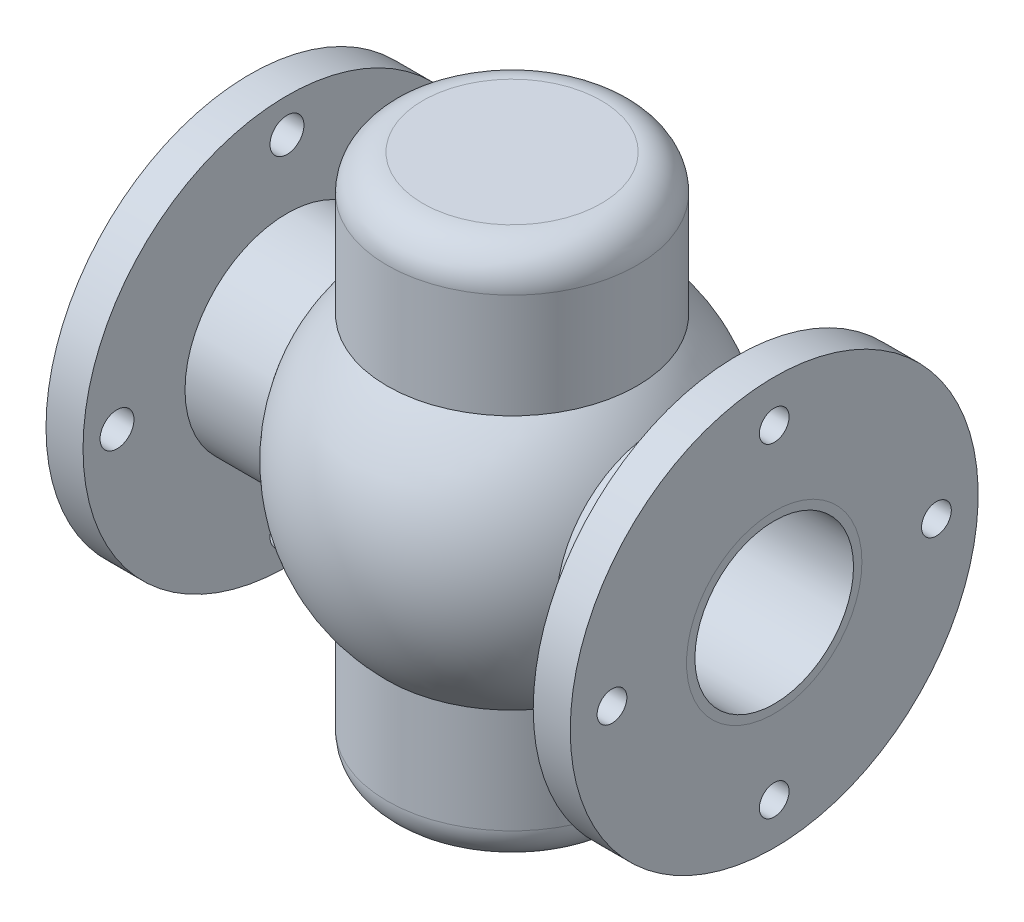
ISO-10303-21;
HEADER;
FILE_DESCRIPTION(('STEP AP214'),'2;1');
FILE_NAME('part.step','',(''),(''),'','','');
FILE_SCHEMA(('AUTOMOTIVE_DESIGN { 1 0 10303 214 1 1 1 1 }'));
ENDSEC;
DATA;
#1=APPLICATION_CONTEXT('core data for automotive mechanical design processes');
#2=APPLICATION_PROTOCOL_DEFINITION('international standard','automotive_design',2000,#1);
#3=PRODUCT_CONTEXT('',#1,'mechanical');
#4=PRODUCT('Part','Part','',(#3));
#5=PRODUCT_RELATED_PRODUCT_CATEGORY('part','',(#4));
#6=PRODUCT_DEFINITION_FORMATION('','',#4);
#7=PRODUCT_DEFINITION_CONTEXT('part definition',#1,'design');
#8=PRODUCT_DEFINITION('design','',#6,#7);
#9=PRODUCT_DEFINITION_SHAPE('','',#8);
#10=(LENGTH_UNIT() NAMED_UNIT(*) SI_UNIT(.MILLI.,.METRE.));
#11=(NAMED_UNIT(*) PLANE_ANGLE_UNIT() SI_UNIT($,.RADIAN.));
#12=(NAMED_UNIT(*) SI_UNIT($,.STERADIAN.) SOLID_ANGLE_UNIT());
#13=UNCERTAINTY_MEASURE_WITH_UNIT(LENGTH_MEASURE(1.E-05),#10,'distance_accuracy_value','');
#14=(GEOMETRIC_REPRESENTATION_CONTEXT(3) GLOBAL_UNCERTAINTY_ASSIGNED_CONTEXT((#13)) GLOBAL_UNIT_ASSIGNED_CONTEXT((#10,
#11,#12)) REPRESENTATION_CONTEXT('',''));
#15=CARTESIAN_POINT('',(0.,0.,0.));
#16=DIRECTION('',(0.,0.,1.));
#17=DIRECTION('',(1.,0.,0.));
#18=AXIS2_PLACEMENT_3D('',#15,#16,#17);
#19=CARTESIAN_POINT('',(146.9,114.3,0.));
#20=DIRECTION('',(1.,0.,0.));
#21=DIRECTION('',(0.,0.,-1.));
#22=AXIS2_PLACEMENT_3D('',#19,#20,#21);
#23=PLANE('',#22);
#24=CARTESIAN_POINT('',(146.9,90.8527596999048,0.));
#25=DIRECTION('',(-1.,0.,0.));
#26=DIRECTION('',(0.,0.,1.));
#27=AXIS2_PLACEMENT_3D('',#24,#25,#26);
#28=CIRCLE('',#27,8.33373999999998);
#29=CARTESIAN_POINT('',(146.9,90.8527596999048,8.33373999999998));
#30=VERTEX_POINT('',#29);
#31=EDGE_CURVE('E161',#30,#30,#28,.T.);
#32=ORIENTED_EDGE('',*,*,#31,.T.);
#33=EDGE_LOOP('',(#32));
#34=FACE_BOUND('',#33,.T.);
#35=CARTESIAN_POINT('',(146.9,0.,90.9113801471292));
#36=DIRECTION('',(-1.,0.,0.));
#37=DIRECTION('',(0.,0.,1.));
#38=AXIS2_PLACEMENT_3D('',#35,#36,#37);
#39=CIRCLE('',#38,8.33373999999998);
#40=CARTESIAN_POINT('',(146.9,0.,99.2451201471292));
#41=VERTEX_POINT('',#40);
#42=EDGE_CURVE('E155',#41,#41,#39,.T.);
#43=ORIENTED_EDGE('',*,*,#42,.T.);
#44=EDGE_LOOP('',(#43));
#45=FACE_BOUND('',#44,.T.);
#46=CARTESIAN_POINT('',(146.9,-90.9113801471291,0.));
#47=DIRECTION('',(-1.,0.,0.));
#48=DIRECTION('',(0.,0.,1.));
#49=AXIS2_PLACEMENT_3D('',#46,#47,#48);
#50=CIRCLE('',#49,8.33373999999999);
#51=CARTESIAN_POINT('',(146.9,-90.9113801471291,8.33373999999999));
#52=VERTEX_POINT('',#51);
#53=EDGE_CURVE('E149',#52,#52,#50,.T.);
#54=ORIENTED_EDGE('',*,*,#53,.T.);
#55=EDGE_LOOP('',(#54));
#56=FACE_BOUND('',#55,.T.);
#57=CARTESIAN_POINT('',(146.9,0.,-90.9113801471292));
#58=DIRECTION('',(-1.,0.,0.));
#59=DIRECTION('',(0.,0.,1.));
#60=AXIS2_PLACEMENT_3D('',#57,#58,#59);
#61=CIRCLE('',#60,8.33373999999998);
#62=CARTESIAN_POINT('',(146.9,0.,-82.5776401471292));
#63=VERTEX_POINT('',#62);
#64=EDGE_CURVE('E143',#63,#63,#61,.T.);
#65=ORIENTED_EDGE('',*,*,#64,.T.);
#66=EDGE_LOOP('',(#65));
#67=FACE_BOUND('',#66,.T.);
#68=CARTESIAN_POINT('',(146.9,0.,0.));
#69=DIRECTION('',(-1.,0.,0.));
#70=DIRECTION('',(0.,0.,1.));
#71=AXIS2_PLACEMENT_3D('',#68,#69,#70);
#72=CIRCLE('',#71,114.3);
#73=CARTESIAN_POINT('',(146.9,0.,114.3));
#74=VERTEX_POINT('',#73);
#75=EDGE_CURVE('E84',#74,#74,#72,.T.);
#76=ORIENTED_EDGE('',*,*,#75,.F.);
#77=EDGE_LOOP('',(#76));
#78=FACE_BOUND('',#77,.T.);
#79=CARTESIAN_POINT('',(146.9,0.,0.));
#80=DIRECTION('',(1.,0.,0.));
#81=DIRECTION('',(0.,0.,-1.));
#82=AXIS2_PLACEMENT_3D('',#79,#80,#81);
#83=CIRCLE('',#82,49.1499994635115);
#84=CARTESIAN_POINT('',(146.9,0.,-49.1499994635115));
#85=VERTEX_POINT('',#84);
#86=EDGE_CURVE('E10',#85,#85,#83,.F.);
#87=ORIENTED_EDGE('',*,*,#86,.T.);
#88=EDGE_LOOP('',(#87));
#89=FACE_BOUND('',#88,.T.);
#90=ADVANCED_FACE('F43',(#34,#45,#56,#67,#78,#89),#23,.T.);
#91=CARTESIAN_POINT('',(150.,0.,0.));
#92=DIRECTION('',(-1.,0.,0.));
#93=DIRECTION('',(0.,0.,1.));
#94=AXIS2_PLACEMENT_3D('',#91,#92,#93);
#95=CYLINDRICAL_SURFACE('',#94,44.45);
#96=CARTESIAN_POINT('',(-150.,0.,0.));
#97=DIRECTION('',(-1.,0.,0.));
#98=DIRECTION('',(0.,0.,1.));
#99=AXIS2_PLACEMENT_3D('',#96,#97,#98);
#100=CIRCLE('',#99,44.45);
#101=CARTESIAN_POINT('',(-150.,0.,44.45));
#102=VERTEX_POINT('',#101);
#103=EDGE_CURVE('E74',#102,#102,#100,.T.);
#104=ORIENTED_EDGE('',*,*,#103,.T.);
#105=EDGE_LOOP('',(#104));
#106=FACE_BOUND('',#105,.T.);
#107=CARTESIAN_POINT('',(146.9,0.,0.));
#108=DIRECTION('',(1.,0.,0.));
#109=DIRECTION('',(0.,0.,-1.));
#110=AXIS2_PLACEMENT_3D('',#107,#108,#109);
#111=CIRCLE('',#110,44.45);
#112=CARTESIAN_POINT('',(146.9,0.,-44.45));
#113=VERTEX_POINT('',#112);
#114=EDGE_CURVE('E129',#113,#113,#111,.F.);
#115=ORIENTED_EDGE('',*,*,#114,.F.);
#116=EDGE_LOOP('',(#115));
#117=FACE_BOUND('',#116,.T.);
#118=ADVANCED_FACE('F194',(#106,#117),#95,.F.);
#119=CARTESIAN_POINT('',(150.,0.,0.));
#120=DIRECTION('',(-1.,0.,0.));
#121=DIRECTION('',(0.,0.,1.));
#122=AXIS2_PLACEMENT_3D('',#119,#120,#121);
#123=CYLINDRICAL_SURFACE('',#122,57.15);
#124=CARTESIAN_POINT('',(126.15,0.,0.));
#125=DIRECTION('',(-1.,0.,0.));
#126=DIRECTION('',(0.,0.,1.));
#127=AXIS2_PLACEMENT_3D('',#124,#125,#126);
#128=CIRCLE('',#127,57.15);
#129=CARTESIAN_POINT('',(126.15,0.,57.15));
#130=VERTEX_POINT('',#129);
#131=EDGE_CURVE('E90',#130,#130,#128,.T.);
#132=ORIENTED_EDGE('',*,*,#131,.T.);
#133=EDGE_LOOP('',(#132));
#134=FACE_BOUND('',#133,.T.);
#135=CARTESIAN_POINT('',(82.0602065559184,0.,0.));
#136=DIRECTION('',(-1.,0.,0.));
#137=DIRECTION('',(0.,0.,1.));
#138=AXIS2_PLACEMENT_3D('',#135,#136,#137);
#139=CIRCLE('',#138,57.15);
#140=CARTESIAN_POINT('',(82.0602065559184,0.,57.15));
#141=VERTEX_POINT('',#140);
#142=EDGE_CURVE('E69',#141,#141,#139,.T.);
#143=ORIENTED_EDGE('',*,*,#142,.F.);
#144=EDGE_LOOP('',(#143));
#145=FACE_BOUND('',#144,.T.);
#146=ADVANCED_FACE('F190',(#134,#145),#123,.T.);
#147=CARTESIAN_POINT('',(0.,0.,0.));
#148=DIRECTION('',(0.,-1.,0.));
#149=DIRECTION('',(1.,0.,0.));
#150=AXIS2_PLACEMENT_3D('',#147,#148,#149);
#151=SPHERICAL_SURFACE('',#150,100.);
#152=CARTESIAN_POINT('',(0.,-71.4142842854285,0.));
#153=DIRECTION('',(0.,1.,0.));
#154=DIRECTION('',(0.,0.,1.));
#155=AXIS2_PLACEMENT_3D('',#152,#153,#154);
#156=CIRCLE('',#155,70.);
#157=CARTESIAN_POINT('',(0.,-71.4142842854285,70.));
#158=VERTEX_POINT('',#157);
#159=EDGE_CURVE('E77',#158,#158,#156,.T.);
#160=ORIENTED_EDGE('',*,*,#159,.T.);
#161=EDGE_LOOP('',(#160));
#162=FACE_BOUND('',#161,.T.);
#163=CARTESIAN_POINT('',(-82.0602065559184,0.,0.));
#164=DIRECTION('',(1.,0.,0.));
#165=DIRECTION('',(0.,0.,-1.));
#166=AXIS2_PLACEMENT_3D('',#163,#164,#165);
#167=CIRCLE('',#166,57.15);
#168=CARTESIAN_POINT('',(-82.0602065559184,0.,-57.15));
#169=VERTEX_POINT('',#168);
#170=EDGE_CURVE('E70',#169,#169,#167,.T.);
#171=ORIENTED_EDGE('',*,*,#170,.T.);
#172=EDGE_LOOP('',(#171));
#173=FACE_BOUND('',#172,.T.);
#174=CARTESIAN_POINT('',(0.,71.4142842854285,0.));
#175=DIRECTION('',(0.,-1.,0.));
#176=DIRECTION('',(0.,0.,-1.));
#177=AXIS2_PLACEMENT_3D('',#174,#175,#176);
#178=CIRCLE('',#177,70.);
#179=CARTESIAN_POINT('',(0.,71.4142842854285,-70.));
#180=VERTEX_POINT('',#179);
#181=EDGE_CURVE('E73',#180,#180,#178,.T.);
#182=ORIENTED_EDGE('',*,*,#181,.T.);
#183=EDGE_LOOP('',(#182));
#184=FACE_BOUND('',#183,.T.);
#185=ORIENTED_EDGE('',*,*,#142,.T.);
#186=EDGE_LOOP('',(#185));
#187=FACE_BOUND('',#186,.T.);
#188=ADVANCED_FACE('F193',(#162,#173,#184,#187),#151,.T.);
#189=CARTESIAN_POINT('',(-150.,0.,0.));
#190=DIRECTION('',(1.,0.,0.));
#191=DIRECTION('',(0.,0.,-1.));
#192=AXIS2_PLACEMENT_3D('',#189,#190,#191);
#193=PLANE('',#192);
#194=ORIENTED_EDGE('',*,*,#103,.F.);
#195=EDGE_LOOP('',(#194));
#196=FACE_BOUND('',#195,.T.);
#197=CARTESIAN_POINT('',(-150.,0.,0.));
#198=DIRECTION('',(-1.,0.,0.));
#199=DIRECTION('',(0.,0.,1.));
#200=AXIS2_PLACEMENT_3D('',#197,#198,#199);
#201=CIRCLE('',#200,67.5);
#202=CARTESIAN_POINT('',(-150.,0.,67.5));
#203=VERTEX_POINT('',#202);
#204=EDGE_CURVE('E93',#203,#203,#201,.T.);
#205=ORIENTED_EDGE('',*,*,#204,.T.);
#206=EDGE_LOOP('',(#205));
#207=FACE_BOUND('',#206,.T.);
#208=ADVANCED_FACE('F200',(#196,#207),#193,.F.);
#209=CARTESIAN_POINT('',(-126.15,0.,0.));
#210=DIRECTION('',(-1.,0.,0.));
#211=DIRECTION('',(0.,0.,1.));
#212=AXIS2_PLACEMENT_3D('',#209,#210,#211);
#213=CIRCLE('',#212,57.15);
#214=CARTESIAN_POINT('',(-126.15,0.,57.15));
#215=VERTEX_POINT('',#214);
#216=EDGE_CURVE('E108',#215,#215,#213,.T.);
#217=ORIENTED_EDGE('',*,*,#216,.F.);
#218=EDGE_LOOP('',(#217));
#219=FACE_BOUND('',#218,.T.);
#220=ORIENTED_EDGE('',*,*,#170,.F.);
#221=EDGE_LOOP('',(#220));
#222=FACE_BOUND('',#221,.T.);
#223=ADVANCED_FACE('F196',(#219,#222),#123,.T.);
#224=CARTESIAN_POINT('',(0.,150.,0.));
#225=DIRECTION('',(0.,1.,0.));
#226=DIRECTION('',(0.,0.,1.));
#227=AXIS2_PLACEMENT_3D('',#224,#225,#226);
#228=PLANE('',#227);
#229=CARTESIAN_POINT('',(0.,150.,0.));
#230=DIRECTION('',(0.,1.,0.));
#231=DIRECTION('',(0.,0.,1.));
#232=AXIS2_PLACEMENT_3D('',#229,#230,#231);
#233=CIRCLE('',#232,50.);
#234=CARTESIAN_POINT('',(0.,150.,50.));
#235=VERTEX_POINT('',#234);
#236=EDGE_CURVE('E66',#235,#235,#233,.T.);
#237=ORIENTED_EDGE('',*,*,#236,.T.);
#238=EDGE_LOOP('',(#237));
#239=FACE_BOUND('',#238,.T.);
#240=ADVANCED_FACE('F250',(#239),#228,.T.);
#241=CARTESIAN_POINT('',(0.,150.,0.));
#242=DIRECTION('',(0.,-1.,0.));
#243=DIRECTION('',(0.,0.,-1.));
#244=AXIS2_PLACEMENT_3D('',#241,#242,#243);
#245=CYLINDRICAL_SURFACE('',#244,70.);
#246=CARTESIAN_POINT('',(0.,130.,0.));
#247=DIRECTION('',(0.,1.,0.));
#248=DIRECTION('',(0.,0.,1.));
#249=AXIS2_PLACEMENT_3D('',#246,#247,#248);
#250=CIRCLE('',#249,70.);
#251=CARTESIAN_POINT('',(0.,130.,70.));
#252=VERTEX_POINT('',#251);
#253=EDGE_CURVE('E61',#252,#252,#250,.F.);
#254=ORIENTED_EDGE('',*,*,#253,.T.);
#255=EDGE_LOOP('',(#254));
#256=FACE_BOUND('',#255,.T.);
#257=ORIENTED_EDGE('',*,*,#181,.F.);
#258=EDGE_LOOP('',(#257));
#259=FACE_BOUND('',#258,.T.);
#260=ADVANCED_FACE('F243',(#256,#259),#245,.T.);
#261=CARTESIAN_POINT('',(0.,-150.,0.));
#262=DIRECTION('',(0.,1.,0.));
#263=DIRECTION('',(0.,0.,1.));
#264=AXIS2_PLACEMENT_3D('',#261,#262,#263);
#265=PLANE('',#264);
#266=CARTESIAN_POINT('',(0.,-150.,0.));
#267=DIRECTION('',(0.,1.,0.));
#268=DIRECTION('',(0.,0.,1.));
#269=AXIS2_PLACEMENT_3D('',#266,#267,#268);
#270=CIRCLE('',#269,50.);
#271=CARTESIAN_POINT('',(0.,-150.,50.));
#272=VERTEX_POINT('',#271);
#273=EDGE_CURVE('E51',#272,#272,#270,.F.);
#274=ORIENTED_EDGE('',*,*,#273,.T.);
#275=EDGE_LOOP('',(#274));
#276=FACE_BOUND('',#275,.T.);
#277=ADVANCED_FACE('F241',(#276),#265,.F.);
#278=CARTESIAN_POINT('',(0.,-130.,0.));
#279=DIRECTION('',(0.,1.,0.));
#280=DIRECTION('',(0.,0.,1.));
#281=AXIS2_PLACEMENT_3D('',#278,#279,#280);
#282=CIRCLE('',#281,70.);
#283=CARTESIAN_POINT('',(0.,-130.,70.));
#284=VERTEX_POINT('',#283);
#285=EDGE_CURVE('E57',#284,#284,#282,.T.);
#286=ORIENTED_EDGE('',*,*,#285,.T.);
#287=EDGE_LOOP('',(#286));
#288=FACE_BOUND('',#287,.T.);
#289=ORIENTED_EDGE('',*,*,#159,.F.);
#290=EDGE_LOOP('',(#289));
#291=FACE_BOUND('',#290,.T.);
#292=ADVANCED_FACE('F234',(#288,#291),#245,.T.);
#293=CARTESIAN_POINT('',(0.,130.,0.));
#294=DIRECTION('',(0.,1.,0.));
#295=DIRECTION('',(0.,0.,1.));
#296=AXIS2_PLACEMENT_3D('',#293,#294,#295);
#297=TOROIDAL_SURFACE('',#296,50.,20.);
#298=ORIENTED_EDGE('',*,*,#253,.F.);
#299=EDGE_LOOP('',(#298));
#300=FACE_BOUND('',#299,.T.);
#301=ORIENTED_EDGE('',*,*,#236,.F.);
#302=EDGE_LOOP('',(#301));
#303=FACE_BOUND('',#302,.T.);
#304=ADVANCED_FACE('F226',(#300,#303),#297,.T.);
#305=CARTESIAN_POINT('',(0.,-130.,0.));
#306=DIRECTION('',(0.,1.,0.));
#307=DIRECTION('',(0.,0.,1.));
#308=AXIS2_PLACEMENT_3D('',#305,#306,#307);
#309=TOROIDAL_SURFACE('',#308,50.,20.);
#310=ORIENTED_EDGE('',*,*,#273,.F.);
#311=EDGE_LOOP('',(#310));
#312=FACE_BOUND('',#311,.T.);
#313=ORIENTED_EDGE('',*,*,#285,.F.);
#314=EDGE_LOOP('',(#313));
#315=FACE_BOUND('',#314,.T.);
#316=ADVANCED_FACE('F45',(#312,#315),#309,.T.);
#317=ORIENTED_EDGE('',*,*,#86,.F.);
#318=EDGE_LOOP('',(#317));
#319=FACE_BOUND('',#318,.T.);
#320=ORIENTED_EDGE('',*,*,#114,.T.);
#321=EDGE_LOOP('',(#320));
#322=FACE_BOUND('',#321,.T.);
#323=ADVANCED_FACE('F213',(#319,#322),#23,.T.);
#324=CARTESIAN_POINT('',(0.,0.,0.));
#325=DIRECTION('',(-1.,0.,0.));
#326=DIRECTION('',(0.,0.,1.));
#327=AXIS2_PLACEMENT_3D('',#324,#325,#326);
#328=CYLINDRICAL_SURFACE('',#327,114.3);
#329=ORIENTED_EDGE('',*,*,#75,.T.);
#330=EDGE_LOOP('',(#329));
#331=FACE_BOUND('',#330,.T.);
#332=CARTESIAN_POINT('',(126.15,0.,0.));
#333=DIRECTION('',(-1.,0.,0.));
#334=DIRECTION('',(0.,0.,1.));
#335=AXIS2_PLACEMENT_3D('',#332,#333,#334);
#336=CIRCLE('',#335,114.3);
#337=CARTESIAN_POINT('',(126.15,0.,114.3));
#338=VERTEX_POINT('',#337);
#339=EDGE_CURVE('E87',#338,#338,#336,.T.);
#340=ORIENTED_EDGE('',*,*,#339,.F.);
#341=EDGE_LOOP('',(#340));
#342=FACE_BOUND('',#341,.T.);
#343=ADVANCED_FACE('F178',(#331,#342),#328,.T.);
#344=CARTESIAN_POINT('',(126.15,57.15,0.));
#345=DIRECTION('',(-1.,0.,0.));
#346=DIRECTION('',(0.,0.,1.));
#347=AXIS2_PLACEMENT_3D('',#344,#345,#346);
#348=PLANE('',#347);
#349=CARTESIAN_POINT('',(126.15,90.8527596999048,0.));
#350=DIRECTION('',(-1.,0.,0.));
#351=DIRECTION('',(0.,0.,1.));
#352=AXIS2_PLACEMENT_3D('',#349,#350,#351);
#353=CIRCLE('',#352,8.33373999999999);
#354=CARTESIAN_POINT('',(126.15,90.8527596999048,8.33373999999999));
#355=VERTEX_POINT('',#354);
#356=EDGE_CURVE('E158',#355,#355,#353,.T.);
#357=ORIENTED_EDGE('',*,*,#356,.F.);
#358=EDGE_LOOP('',(#357));
#359=FACE_BOUND('',#358,.T.);
#360=CARTESIAN_POINT('',(126.15,0.,90.9113801471292));
#361=DIRECTION('',(-1.,0.,0.));
#362=DIRECTION('',(0.,0.,1.));
#363=AXIS2_PLACEMENT_3D('',#360,#361,#362);
#364=CIRCLE('',#363,8.33373999999999);
#365=CARTESIAN_POINT('',(126.15,0.,99.2451201471292));
#366=VERTEX_POINT('',#365);
#367=EDGE_CURVE('E152',#366,#366,#364,.T.);
#368=ORIENTED_EDGE('',*,*,#367,.F.);
#369=EDGE_LOOP('',(#368));
#370=FACE_BOUND('',#369,.T.);
#371=CARTESIAN_POINT('',(126.15,-90.9113801471291,0.));
#372=DIRECTION('',(-1.,0.,0.));
#373=DIRECTION('',(0.,0.,1.));
#374=AXIS2_PLACEMENT_3D('',#371,#372,#373);
#375=CIRCLE('',#374,8.33373999999999);
#376=CARTESIAN_POINT('',(126.15,-90.9113801471291,8.33373999999999));
#377=VERTEX_POINT('',#376);
#378=EDGE_CURVE('E146',#377,#377,#375,.T.);
#379=ORIENTED_EDGE('',*,*,#378,.F.);
#380=EDGE_LOOP('',(#379));
#381=FACE_BOUND('',#380,.T.);
#382=CARTESIAN_POINT('',(126.15,0.,-90.9113801471292));
#383=DIRECTION('',(-1.,0.,0.));
#384=DIRECTION('',(0.,0.,1.));
#385=AXIS2_PLACEMENT_3D('',#382,#383,#384);
#386=CIRCLE('',#385,8.33373999999999);
#387=CARTESIAN_POINT('',(126.15,0.,-82.5776401471292));
#388=VERTEX_POINT('',#387);
#389=EDGE_CURVE('E140',#388,#388,#386,.T.);
#390=ORIENTED_EDGE('',*,*,#389,.F.);
#391=EDGE_LOOP('',(#390));
#392=FACE_BOUND('',#391,.T.);
#393=ORIENTED_EDGE('',*,*,#339,.T.);
#394=EDGE_LOOP('',(#393));
#395=FACE_BOUND('',#394,.T.);
#396=ORIENTED_EDGE('',*,*,#131,.F.);
#397=EDGE_LOOP('',(#396));
#398=FACE_BOUND('',#397,.T.);
#399=ADVANCED_FACE('F174',(#359,#370,#381,#392,#395,#398),#348,.T.);
#400=CARTESIAN_POINT('',(0.,0.,0.));
#401=DIRECTION('',(1.,0.,0.));
#402=DIRECTION('',(0.,0.,1.));
#403=AXIS2_PLACEMENT_3D('',#400,#401,#402);
#404=CYLINDRICAL_SURFACE('',#403,67.5);
#405=ORIENTED_EDGE('',*,*,#204,.F.);
#406=EDGE_LOOP('',(#405));
#407=FACE_BOUND('',#406,.T.);
#408=CARTESIAN_POINT('',(-146.9,0.,0.));
#409=DIRECTION('',(-1.,0.,0.));
#410=DIRECTION('',(0.,0.,1.));
#411=AXIS2_PLACEMENT_3D('',#408,#409,#410);
#412=CIRCLE('',#411,67.5);
#413=CARTESIAN_POINT('',(-146.9,0.,67.5));
#414=VERTEX_POINT('',#413);
#415=EDGE_CURVE('E97',#414,#414,#412,.T.);
#416=ORIENTED_EDGE('',*,*,#415,.T.);
#417=EDGE_LOOP('',(#416));
#418=FACE_BOUND('',#417,.T.);
#419=ADVANCED_FACE('F177',(#407,#418),#404,.T.);
#420=CARTESIAN_POINT('',(-146.9,114.3,0.));
#421=DIRECTION('',(-1.,0.,0.));
#422=DIRECTION('',(0.,0.,-1.));
#423=AXIS2_PLACEMENT_3D('',#420,#421,#422);
#424=PLANE('',#423);
#425=CARTESIAN_POINT('',(-146.9,-95.25,-6.65127195049617E-13));
#426=DIRECTION('',(-1.,0.,0.));
#427=DIRECTION('',(0.,0.,-1.));
#428=AXIS2_PLACEMENT_3D('',#425,#426,#427);
#429=CIRCLE('',#428,9.49999999999999);
#430=CARTESIAN_POINT('',(-146.9,-95.2499999999999,-9.50000000000066));
#431=VERTEX_POINT('',#430);
#432=EDGE_CURVE('E132',#431,#431,#429,.T.);
#433=ORIENTED_EDGE('',*,*,#432,.F.);
#434=EDGE_LOOP('',(#433));
#435=FACE_BOUND('',#434,.T.);
#436=CARTESIAN_POINT('',(-146.9,9.97690792574425E-13,-95.25));
#437=DIRECTION('',(-1.,0.,0.));
#438=DIRECTION('',(0.,1.,0.));
#439=AXIS2_PLACEMENT_3D('',#436,#437,#438);
#440=CIRCLE('',#439,9.49999999999999);
#441=CARTESIAN_POINT('',(-146.9,9.50000000000099,-95.2499999999999));
#442=VERTEX_POINT('',#441);
#443=EDGE_CURVE('E124',#442,#442,#440,.T.);
#444=ORIENTED_EDGE('',*,*,#443,.F.);
#445=EDGE_LOOP('',(#444));
#446=FACE_BOUND('',#445,.T.);
#447=CARTESIAN_POINT('',(-146.9,-3.32563597524808E-13,95.25));
#448=DIRECTION('',(-1.,0.,0.));
#449=DIRECTION('',(0.,-1.,0.));
#450=AXIS2_PLACEMENT_3D('',#447,#448,#449);
#451=CIRCLE('',#450,9.49999999999999);
#452=CARTESIAN_POINT('',(-146.9,-9.50000000000032,95.25));
#453=VERTEX_POINT('',#452);
#454=EDGE_CURVE('E118',#453,#453,#451,.T.);
#455=ORIENTED_EDGE('',*,*,#454,.F.);
#456=EDGE_LOOP('',(#455));
#457=FACE_BOUND('',#456,.T.);
#458=CARTESIAN_POINT('',(-146.9,95.25,0.));
#459=DIRECTION('',(-1.,0.,0.));
#460=DIRECTION('',(0.,0.,1.));
#461=AXIS2_PLACEMENT_3D('',#458,#459,#460);
#462=CIRCLE('',#461,9.49999999999999);
#463=CARTESIAN_POINT('',(-146.9,95.25,9.49999999999999));
#464=VERTEX_POINT('',#463);
#465=EDGE_CURVE('E112',#464,#464,#462,.T.);
#466=ORIENTED_EDGE('',*,*,#465,.F.);
#467=EDGE_LOOP('',(#466));
#468=FACE_BOUND('',#467,.T.);
#469=ORIENTED_EDGE('',*,*,#415,.F.);
#470=EDGE_LOOP('',(#469));
#471=FACE_BOUND('',#470,.T.);
#472=CARTESIAN_POINT('',(-146.9,0.,0.));
#473=DIRECTION('',(-1.,0.,0.));
#474=DIRECTION('',(0.,0.,1.));
#475=AXIS2_PLACEMENT_3D('',#472,#473,#474);
#476=CIRCLE('',#475,114.3);
#477=CARTESIAN_POINT('',(-146.9,0.,114.3));
#478=VERTEX_POINT('',#477);
#479=EDGE_CURVE('E101',#478,#478,#476,.T.);
#480=ORIENTED_EDGE('',*,*,#479,.T.);
#481=EDGE_LOOP('',(#480));
#482=FACE_BOUND('',#481,.T.);
#483=ADVANCED_FACE('F285',(#435,#446,#457,#468,#471,#482),#424,.T.);
#484=CARTESIAN_POINT('',(0.,0.,0.));
#485=DIRECTION('',(1.,0.,0.));
#486=DIRECTION('',(0.,0.,1.));
#487=AXIS2_PLACEMENT_3D('',#484,#485,#486);
#488=CYLINDRICAL_SURFACE('',#487,114.3);
#489=ORIENTED_EDGE('',*,*,#479,.F.);
#490=EDGE_LOOP('',(#489));
#491=FACE_BOUND('',#490,.T.);
#492=CARTESIAN_POINT('',(-126.15,0.,0.));
#493=DIRECTION('',(-1.,0.,0.));
#494=DIRECTION('',(0.,0.,1.));
#495=AXIS2_PLACEMENT_3D('',#492,#493,#494);
#496=CIRCLE('',#495,114.3);
#497=CARTESIAN_POINT('',(-126.15,0.,114.3));
#498=VERTEX_POINT('',#497);
#499=EDGE_CURVE('E105',#498,#498,#496,.T.);
#500=ORIENTED_EDGE('',*,*,#499,.T.);
#501=EDGE_LOOP('',(#500));
#502=FACE_BOUND('',#501,.T.);
#503=ADVANCED_FACE('F275',(#491,#502),#488,.T.);
#504=CARTESIAN_POINT('',(-126.15,57.15,0.));
#505=DIRECTION('',(1.,0.,0.));
#506=DIRECTION('',(0.,0.,1.));
#507=AXIS2_PLACEMENT_3D('',#504,#505,#506);
#508=PLANE('',#507);
#509=CARTESIAN_POINT('',(-126.15,-95.25,-6.65127195049617E-13));
#510=DIRECTION('',(1.,0.,0.));
#511=DIRECTION('',(0.,0.,-1.));
#512=AXIS2_PLACEMENT_3D('',#509,#510,#511);
#513=CIRCLE('',#512,9.49999999999999);
#514=CARTESIAN_POINT('',(-126.15,-95.25,-9.50000000000066));
#515=VERTEX_POINT('',#514);
#516=EDGE_CURVE('E121',#515,#515,#513,.F.);
#517=ORIENTED_EDGE('',*,*,#516,.T.);
#518=EDGE_LOOP('',(#517));
#519=FACE_BOUND('',#518,.T.);
#520=CARTESIAN_POINT('',(-126.15,9.97690792574425E-13,-95.25));
#521=DIRECTION('',(1.,0.,0.));
#522=DIRECTION('',(0.,0.,-1.));
#523=AXIS2_PLACEMENT_3D('',#520,#521,#522);
#524=CIRCLE('',#523,9.49999999999999);
#525=CARTESIAN_POINT('',(-126.15,9.97690792574425E-13,-104.75));
#526=VERTEX_POINT('',#525);
#527=EDGE_CURVE('E128',#526,#526,#524,.F.);
#528=ORIENTED_EDGE('',*,*,#527,.T.);
#529=EDGE_LOOP('',(#528));
#530=FACE_BOUND('',#529,.T.);
#531=CARTESIAN_POINT('',(-126.15,-3.32563597524808E-13,95.25));
#532=DIRECTION('',(1.,0.,0.));
#533=DIRECTION('',(0.,0.,-1.));
#534=AXIS2_PLACEMENT_3D('',#531,#532,#533);
#535=CIRCLE('',#534,9.49999999999999);
#536=CARTESIAN_POINT('',(-126.15,-3.32563597524808E-13,85.75));
#537=VERTEX_POINT('',#536);
#538=EDGE_CURVE('E115',#537,#537,#535,.F.);
#539=ORIENTED_EDGE('',*,*,#538,.T.);
#540=EDGE_LOOP('',(#539));
#541=FACE_BOUND('',#540,.T.);
#542=CARTESIAN_POINT('',(-126.15,95.25,0.));
#543=DIRECTION('',(1.,0.,0.));
#544=DIRECTION('',(0.,0.,-1.));
#545=AXIS2_PLACEMENT_3D('',#542,#543,#544);
#546=CIRCLE('',#545,9.49999999999999);
#547=CARTESIAN_POINT('',(-126.15,95.25,-9.49999999999999));
#548=VERTEX_POINT('',#547);
#549=EDGE_CURVE('E111',#548,#548,#546,.F.);
#550=ORIENTED_EDGE('',*,*,#549,.T.);
#551=EDGE_LOOP('',(#550));
#552=FACE_BOUND('',#551,.T.);
#553=ORIENTED_EDGE('',*,*,#499,.F.);
#554=EDGE_LOOP('',(#553));
#555=FACE_BOUND('',#554,.T.);
#556=ORIENTED_EDGE('',*,*,#216,.T.);
#557=EDGE_LOOP('',(#556));
#558=FACE_BOUND('',#557,.T.);
#559=ADVANCED_FACE('F272',(#519,#530,#541,#552,#555,#558),#508,.T.);
#560=CARTESIAN_POINT('',(150.001,95.25,0.));
#561=DIRECTION('',(-1.,0.,0.));
#562=DIRECTION('',(0.,0.,1.));
#563=AXIS2_PLACEMENT_3D('',#560,#561,#562);
#564=CYLINDRICAL_SURFACE('',#563,9.49999999999999);
#565=ORIENTED_EDGE('',*,*,#549,.F.);
#566=EDGE_LOOP('',(#565));
#567=FACE_BOUND('',#566,.T.);
#568=ORIENTED_EDGE('',*,*,#465,.T.);
#569=EDGE_LOOP('',(#568));
#570=FACE_BOUND('',#569,.T.);
#571=ADVANCED_FACE('F274',(#567,#570),#564,.F.);
#572=CARTESIAN_POINT('',(150.001,-3.32563597524808E-13,95.25));
#573=DIRECTION('',(-1.,0.,0.));
#574=DIRECTION('',(0.,0.,1.));
#575=AXIS2_PLACEMENT_3D('',#572,#573,#574);
#576=CYLINDRICAL_SURFACE('',#575,9.49999999999999);
#577=ORIENTED_EDGE('',*,*,#538,.F.);
#578=EDGE_LOOP('',(#577));
#579=FACE_BOUND('',#578,.T.);
#580=ORIENTED_EDGE('',*,*,#454,.T.);
#581=EDGE_LOOP('',(#580));
#582=FACE_BOUND('',#581,.T.);
#583=ADVANCED_FACE('F282',(#579,#582),#576,.F.);
#584=CARTESIAN_POINT('',(150.001,9.97690792574425E-13,-95.25));
#585=DIRECTION('',(-1.,0.,0.));
#586=DIRECTION('',(0.,0.,1.));
#587=AXIS2_PLACEMENT_3D('',#584,#585,#586);
#588=CYLINDRICAL_SURFACE('',#587,9.49999999999999);
#589=ORIENTED_EDGE('',*,*,#527,.F.);
#590=EDGE_LOOP('',(#589));
#591=FACE_BOUND('',#590,.T.);
#592=ORIENTED_EDGE('',*,*,#443,.T.);
#593=EDGE_LOOP('',(#592));
#594=FACE_BOUND('',#593,.T.);
#595=ADVANCED_FACE('F331',(#591,#594),#588,.F.);
#596=CARTESIAN_POINT('',(150.001,-95.25,-6.65127195049617E-13));
#597=DIRECTION('',(-1.,0.,0.));
#598=DIRECTION('',(0.,0.,1.));
#599=AXIS2_PLACEMENT_3D('',#596,#597,#598);
#600=CYLINDRICAL_SURFACE('',#599,9.49999999999999);
#601=ORIENTED_EDGE('',*,*,#516,.F.);
#602=EDGE_LOOP('',(#601));
#603=FACE_BOUND('',#602,.T.);
#604=ORIENTED_EDGE('',*,*,#432,.T.);
#605=EDGE_LOOP('',(#604));
#606=FACE_BOUND('',#605,.T.);
#607=ADVANCED_FACE('F327',(#603,#606),#600,.F.);
#608=CARTESIAN_POINT('',(126.15,0.,-90.9113801471292));
#609=DIRECTION('',(-1.,0.,0.));
#610=DIRECTION('',(0.,0.,1.));
#611=AXIS2_PLACEMENT_3D('',#608,#609,#610);
#612=CYLINDRICAL_SURFACE('',#611,8.33373999999998);
#613=ORIENTED_EDGE('',*,*,#64,.F.);
#614=EDGE_LOOP('',(#613));
#615=FACE_BOUND('',#614,.T.);
#616=ORIENTED_EDGE('',*,*,#389,.T.);
#617=EDGE_LOOP('',(#616));
#618=FACE_BOUND('',#617,.T.);
#619=ADVANCED_FACE('F420',(#615,#618),#612,.F.);
#620=CARTESIAN_POINT('',(126.15,-90.9113801471291,0.));
#621=DIRECTION('',(-1.,0.,0.));
#622=DIRECTION('',(0.,0.,1.));
#623=AXIS2_PLACEMENT_3D('',#620,#621,#622);
#624=CYLINDRICAL_SURFACE('',#623,8.33373999999999);
#625=ORIENTED_EDGE('',*,*,#53,.F.);
#626=EDGE_LOOP('',(#625));
#627=FACE_BOUND('',#626,.T.);
#628=ORIENTED_EDGE('',*,*,#378,.T.);
#629=EDGE_LOOP('',(#628));
#630=FACE_BOUND('',#629,.T.);
#631=ADVANCED_FACE('F457',(#627,#630),#624,.F.);
#632=CARTESIAN_POINT('',(126.15,0.,90.9113801471292));
#633=DIRECTION('',(-1.,0.,0.));
#634=DIRECTION('',(0.,0.,1.));
#635=AXIS2_PLACEMENT_3D('',#632,#633,#634);
#636=CYLINDRICAL_SURFACE('',#635,8.33373999999998);
#637=ORIENTED_EDGE('',*,*,#42,.F.);
#638=EDGE_LOOP('',(#637));
#639=FACE_BOUND('',#638,.T.);
#640=ORIENTED_EDGE('',*,*,#367,.T.);
#641=EDGE_LOOP('',(#640));
#642=FACE_BOUND('',#641,.T.);
#643=ADVANCED_FACE('F170',(#639,#642),#636,.F.);
#644=CARTESIAN_POINT('',(126.15,90.8527596999048,0.));
#645=DIRECTION('',(-1.,0.,0.));
#646=DIRECTION('',(0.,0.,1.));
#647=AXIS2_PLACEMENT_3D('',#644,#645,#646);
#648=CYLINDRICAL_SURFACE('',#647,8.33373999999998);
#649=ORIENTED_EDGE('',*,*,#31,.F.);
#650=EDGE_LOOP('',(#649));
#651=FACE_BOUND('',#650,.T.);
#652=ORIENTED_EDGE('',*,*,#356,.T.);
#653=EDGE_LOOP('',(#652));
#654=FACE_BOUND('',#653,.T.);
#655=ADVANCED_FACE('F167',(#651,#654),#648,.F.);
#656=CLOSED_SHELL('',(#90,#118,#146,#188,#208,#223,#240,#260,#277,#292,#304,#316,#323,#343,#399,
#419,#483,#503,#559,#571,#583,#595,#607,#619,#631,#643,#655));
#657=MANIFOLD_SOLID_BREP('B2',#656);
#658=ADVANCED_BREP_SHAPE_REPRESENTATION('',(#18,#657),#14);
#659=SHAPE_DEFINITION_REPRESENTATION(#9,#658);
ENDSEC;
END-ISO-10303-21;
